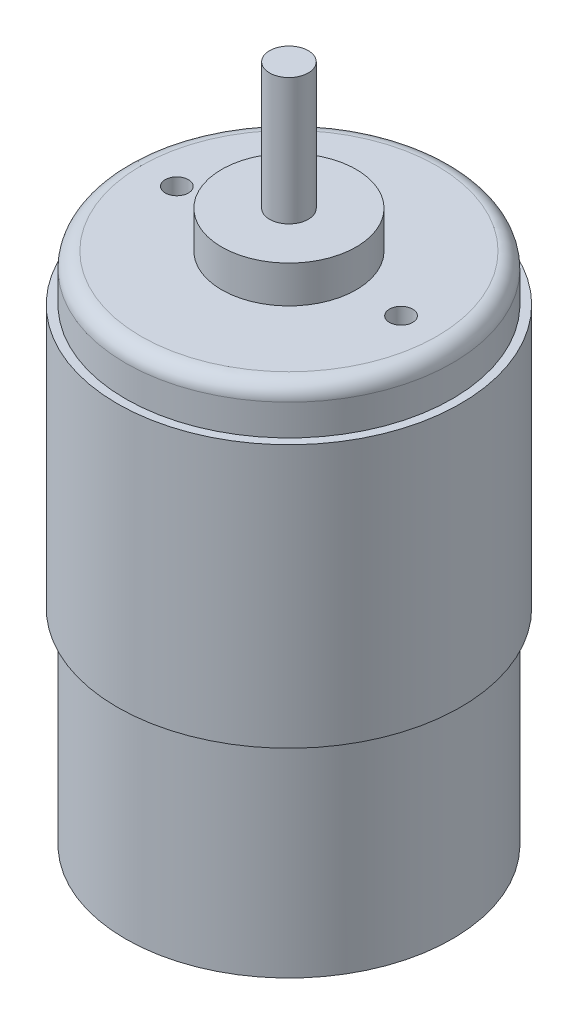
ISO-10303-21;
HEADER;
FILE_DESCRIPTION(('STEP AP214'),'2;1');
FILE_NAME('part.step','',(''),(''),'','','');
FILE_SCHEMA(('AUTOMOTIVE_DESIGN { 1 0 10303 214 1 1 1 1 }'));
ENDSEC;
DATA;
#1=APPLICATION_CONTEXT('core data for automotive mechanical design processes');
#2=APPLICATION_PROTOCOL_DEFINITION('international standard','automotive_design',2000,#1);
#3=PRODUCT_CONTEXT('',#1,'mechanical');
#4=PRODUCT('Part','Part','',(#3));
#5=PRODUCT_RELATED_PRODUCT_CATEGORY('part','',(#4));
#6=PRODUCT_DEFINITION_FORMATION('','',#4);
#7=PRODUCT_DEFINITION_CONTEXT('part definition',#1,'design');
#8=PRODUCT_DEFINITION('design','',#6,#7);
#9=PRODUCT_DEFINITION_SHAPE('','',#8);
#10=(LENGTH_UNIT() NAMED_UNIT(*) SI_UNIT(.MILLI.,.METRE.));
#11=(NAMED_UNIT(*) PLANE_ANGLE_UNIT() SI_UNIT($,.RADIAN.));
#12=(NAMED_UNIT(*) SI_UNIT($,.STERADIAN.) SOLID_ANGLE_UNIT());
#13=UNCERTAINTY_MEASURE_WITH_UNIT(LENGTH_MEASURE(1.E-05),#10,'distance_accuracy_value','');
#14=(GEOMETRIC_REPRESENTATION_CONTEXT(3) GLOBAL_UNCERTAINTY_ASSIGNED_CONTEXT((#13)) GLOBAL_UNIT_ASSIGNED_CONTEXT((#10,
#11,#12)) REPRESENTATION_CONTEXT('',''));
#15=CARTESIAN_POINT('',(0.,0.,0.));
#16=DIRECTION('',(0.,0.,1.));
#17=DIRECTION('',(1.,0.,0.));
#18=AXIS2_PLACEMENT_3D('',#15,#16,#17);
#19=CARTESIAN_POINT('',(0.,26.5,0.));
#20=DIRECTION('',(0.,1.,0.));
#21=DIRECTION('',(0.,0.,1.));
#22=AXIS2_PLACEMENT_3D('',#19,#20,#21);
#23=CYLINDRICAL_SURFACE('',#22,22.2);
#24=DIRECTION('',(0.,1.,0.));
#25=VECTOR('',#24,1.);
#26=CARTESIAN_POINT('',(1.25,26.5,-22.1647806215176));
#27=LINE('',#26,#25);
#28=CARTESIAN_POINT('',(1.25,26.5,-22.1647806215176));
#29=VERTEX_POINT('',#28);
#30=CARTESIAN_POINT('',(1.25,60.5,-22.1647806215176));
#31=VERTEX_POINT('',#30);
#32=EDGE_CURVE('E109',#29,#31,#27,.T.);
#33=ORIENTED_EDGE('',*,*,#32,.T.);
#34=CARTESIAN_POINT('',(0.,60.5,0.));
#35=DIRECTION('',(0.,1.,0.));
#36=DIRECTION('',(0.,0.,1.));
#37=AXIS2_PLACEMENT_3D('',#34,#35,#36);
#38=CIRCLE('',#37,22.2);
#39=CARTESIAN_POINT('',(-1.25,60.5,-22.1647806215176));
#40=VERTEX_POINT('',#39);
#41=EDGE_CURVE('E59',#40,#31,#38,.T.);
#42=ORIENTED_EDGE('',*,*,#41,.F.);
#43=DIRECTION('',(0.,1.,0.));
#44=VECTOR('',#43,1.);
#45=CARTESIAN_POINT('',(-1.25,26.5,-22.1647806215176));
#46=LINE('',#45,#44);
#47=CARTESIAN_POINT('',(-1.25,26.5,-22.1647806215176));
#48=VERTEX_POINT('',#47);
#49=EDGE_CURVE('E66',#48,#40,#46,.T.);
#50=ORIENTED_EDGE('',*,*,#49,.F.);
#51=CARTESIAN_POINT('',(0.,26.5,0.));
#52=DIRECTION('',(0.,1.,0.));
#53=DIRECTION('',(0.,0.,1.));
#54=AXIS2_PLACEMENT_3D('',#51,#52,#53);
#55=CIRCLE('',#54,22.2);
#56=EDGE_CURVE('E424',#48,#29,#55,.T.);
#57=ORIENTED_EDGE('',*,*,#56,.T.);
#58=EDGE_LOOP('',(#33,#42,#50,#57));
#59=FACE_BOUND('',#58,.T.);
#60=ADVANCED_FACE('F43',(#59),#23,.T.);
#61=CARTESIAN_POINT('',(-1.25,26.5,-21.0879853234016));
#62=DIRECTION('',(1.,0.,0.));
#63=DIRECTION('',(0.,0.,-1.));
#64=AXIS2_PLACEMENT_3D('',#61,#62,#63);
#65=PLANE('',#64);
#66=ORIENTED_EDGE('',*,*,#49,.T.);
#67=DIRECTION('',(0.,0.,-1.));
#68=VECTOR('',#67,1.);
#69=CARTESIAN_POINT('',(-1.25,60.5,-21.0879853234016));
#70=LINE('',#69,#68);
#71=CARTESIAN_POINT('',(-1.24999999999999,60.5,-21.0879853234016));
#72=VERTEX_POINT('',#71);
#73=EDGE_CURVE('E96',#72,#40,#70,.T.);
#74=ORIENTED_EDGE('',*,*,#73,.F.);
#75=DIRECTION('',(0.,1.,0.));
#76=VECTOR('',#75,1.);
#77=CARTESIAN_POINT('',(-1.24999999999999,26.5,-21.0879853234016));
#78=LINE('',#77,#76);
#79=CARTESIAN_POINT('',(-1.24999999999999,26.5,-21.0879853234016));
#80=VERTEX_POINT('',#79);
#81=EDGE_CURVE('E93',#80,#72,#78,.T.);
#82=ORIENTED_EDGE('',*,*,#81,.F.);
#83=DIRECTION('',(0.,0.,-1.));
#84=VECTOR('',#83,1.);
#85=CARTESIAN_POINT('',(-1.25,26.5,-21.0879853234016));
#86=LINE('',#85,#84);
#87=EDGE_CURVE('E114',#80,#48,#86,.T.);
#88=ORIENTED_EDGE('',*,*,#87,.T.);
#89=EDGE_LOOP('',(#66,#74,#82,#88));
#90=FACE_BOUND('',#89,.T.);
#91=ADVANCED_FACE('F185',(#90),#65,.T.);
#92=CARTESIAN_POINT('',(1.25,26.5,-21.0879853234016));
#93=DIRECTION('',(-1.,0.,0.));
#94=DIRECTION('',(0.,0.,1.));
#95=AXIS2_PLACEMENT_3D('',#92,#93,#94);
#96=PLANE('',#95);
#97=DIRECTION('',(0.,1.,0.));
#98=VECTOR('',#97,1.);
#99=CARTESIAN_POINT('',(1.25,26.5,-21.0879853234016));
#100=LINE('',#99,#98);
#101=CARTESIAN_POINT('',(1.25,26.5,-21.0879853234016));
#102=VERTEX_POINT('',#101);
#103=CARTESIAN_POINT('',(1.25,60.5,-21.0879853234016));
#104=VERTEX_POINT('',#103);
#105=EDGE_CURVE('E92',#102,#104,#100,.T.);
#106=ORIENTED_EDGE('',*,*,#105,.T.);
#107=DIRECTION('',(0.,0.,1.));
#108=VECTOR('',#107,1.);
#109=CARTESIAN_POINT('',(1.25,60.5,-21.0879853234016));
#110=LINE('',#109,#108);
#111=EDGE_CURVE('E97',#31,#104,#110,.T.);
#112=ORIENTED_EDGE('',*,*,#111,.F.);
#113=ORIENTED_EDGE('',*,*,#32,.F.);
#114=DIRECTION('',(0.,0.,1.));
#115=VECTOR('',#114,1.);
#116=CARTESIAN_POINT('',(1.25,26.5,-21.0879853234016));
#117=LINE('',#116,#115);
#118=EDGE_CURVE('E107',#29,#102,#117,.T.);
#119=ORIENTED_EDGE('',*,*,#118,.T.);
#120=EDGE_LOOP('',(#106,#112,#113,#119));
#121=FACE_BOUND('',#120,.T.);
#122=ADVANCED_FACE('F105',(#121),#96,.T.);
#123=CARTESIAN_POINT('',(0.,66.5,0.));
#124=DIRECTION('',(0.,1.,0.));
#125=DIRECTION('',(0.,0.,1.));
#126=AXIS2_PLACEMENT_3D('',#123,#124,#125);
#127=PLANE('',#126);
#128=CARTESIAN_POINT('',(0.,66.5,0.));
#129=DIRECTION('',(0.,1.,0.));
#130=DIRECTION('',(0.,0.,1.));
#131=AXIS2_PLACEMENT_3D('',#128,#129,#130);
#132=CIRCLE('',#131,19.125);
#133=CARTESIAN_POINT('',(0.,66.5,19.125));
#134=VERTEX_POINT('',#133);
#135=EDGE_CURVE('E52',#134,#134,#132,.T.);
#136=ORIENTED_EDGE('',*,*,#135,.T.);
#137=EDGE_LOOP('',(#136));
#138=FACE_BOUND('',#137,.T.);
#139=CARTESIAN_POINT('',(-14.5,66.5,0.));
#140=DIRECTION('',(0.,1.,0.));
#141=DIRECTION('',(0.,0.,1.));
#142=AXIS2_PLACEMENT_3D('',#139,#140,#141);
#143=CIRCLE('',#142,1.5);
#144=CARTESIAN_POINT('',(-14.5,66.5,1.5));
#145=VERTEX_POINT('',#144);
#146=EDGE_CURVE('E131',#145,#145,#143,.F.);
#147=ORIENTED_EDGE('',*,*,#146,.T.);
#148=EDGE_LOOP('',(#147));
#149=FACE_BOUND('',#148,.T.);
#150=CARTESIAN_POINT('',(0.,66.5,0.));
#151=DIRECTION('',(0.,1.,0.));
#152=DIRECTION('',(0.,0.,1.));
#153=AXIS2_PLACEMENT_3D('',#150,#151,#152);
#154=CIRCLE('',#153,8.7);
#155=CARTESIAN_POINT('',(0.,66.5,8.7));
#156=VERTEX_POINT('',#155);
#157=EDGE_CURVE('E143',#156,#156,#154,.T.);
#158=ORIENTED_EDGE('',*,*,#157,.F.);
#159=EDGE_LOOP('',(#158));
#160=FACE_BOUND('',#159,.T.);
#161=CARTESIAN_POINT('',(14.5,66.5,0.));
#162=DIRECTION('',(0.,1.,0.));
#163=DIRECTION('',(0.,0.,1.));
#164=AXIS2_PLACEMENT_3D('',#161,#162,#163);
#165=CIRCLE('',#164,1.5);
#166=CARTESIAN_POINT('',(14.5,66.5,1.5));
#167=VERTEX_POINT('',#166);
#168=EDGE_CURVE('E123',#167,#167,#165,.T.);
#169=ORIENTED_EDGE('',*,*,#168,.F.);
#170=EDGE_LOOP('',(#169));
#171=FACE_BOUND('',#170,.T.);
#172=ADVANCED_FACE('F173',(#138,#149,#160,#171),#127,.T.);
#173=CARTESIAN_POINT('',(0.,66.5,0.));
#174=DIRECTION('',(0.,-1.,0.));
#175=DIRECTION('',(0.,0.,-1.));
#176=AXIS2_PLACEMENT_3D('',#173,#174,#175);
#177=CYLINDRICAL_SURFACE('',#176,21.125);
#178=CARTESIAN_POINT('',(0.,64.5,0.));
#179=DIRECTION('',(0.,1.,0.));
#180=DIRECTION('',(0.,0.,1.));
#181=AXIS2_PLACEMENT_3D('',#178,#179,#180);
#182=CIRCLE('',#181,21.125);
#183=CARTESIAN_POINT('',(0.,64.5,21.125));
#184=VERTEX_POINT('',#183);
#185=EDGE_CURVE('E11',#184,#184,#182,.F.);
#186=ORIENTED_EDGE('',*,*,#185,.T.);
#187=EDGE_LOOP('',(#186));
#188=FACE_BOUND('',#187,.T.);
#189=CARTESIAN_POINT('',(0.,26.5,0.));
#190=DIRECTION('',(0.,-1.,0.));
#191=DIRECTION('',(0.,0.,1.));
#192=AXIS2_PLACEMENT_3D('',#189,#190,#191);
#193=CIRCLE('',#192,21.125);
#194=EDGE_CURVE('E429',#102,#80,#193,.T.);
#195=ORIENTED_EDGE('',*,*,#194,.T.);
#196=ORIENTED_EDGE('',*,*,#81,.T.);
#197=CARTESIAN_POINT('',(0.,60.5,0.));
#198=DIRECTION('',(0.,-1.,0.));
#199=DIRECTION('',(0.,0.,1.));
#200=AXIS2_PLACEMENT_3D('',#197,#198,#199);
#201=CIRCLE('',#200,21.125);
#202=EDGE_CURVE('E87',#104,#72,#201,.T.);
#203=ORIENTED_EDGE('',*,*,#202,.F.);
#204=ORIENTED_EDGE('',*,*,#105,.F.);
#205=EDGE_LOOP('',(#195,#196,#203,#204));
#206=FACE_BOUND('',#205,.T.);
#207=CARTESIAN_POINT('',(0.,0.,0.));
#208=DIRECTION('',(0.,1.,0.));
#209=DIRECTION('',(0.,0.,1.));
#210=AXIS2_PLACEMENT_3D('',#207,#208,#209);
#211=CIRCLE('',#210,21.125);
#212=CARTESIAN_POINT('',(0.,0.,21.125));
#213=VERTEX_POINT('',#212);
#214=EDGE_CURVE('E163',#213,#213,#211,.T.);
#215=ORIENTED_EDGE('',*,*,#214,.T.);
#216=EDGE_LOOP('',(#215));
#217=FACE_BOUND('',#216,.T.);
#218=ADVANCED_FACE('F89',(#188,#206,#217),#177,.T.);
#219=CARTESIAN_POINT('',(0.,0.,0.));
#220=DIRECTION('',(0.,1.,0.));
#221=DIRECTION('',(0.,0.,1.));
#222=AXIS2_PLACEMENT_3D('',#219,#220,#221);
#223=PLANE('',#222);
#224=CARTESIAN_POINT('',(0.,0.,0.));
#225=DIRECTION('',(0.,-1.,0.));
#226=DIRECTION('',(0.,0.,-1.));
#227=AXIS2_PLACEMENT_3D('',#224,#225,#226);
#228=CIRCLE('',#227,7.2);
#229=CARTESIAN_POINT('',(0.,0.,-7.2));
#230=VERTEX_POINT('',#229);
#231=EDGE_CURVE('E159',#230,#230,#228,.T.);
#232=ORIENTED_EDGE('',*,*,#231,.F.);
#233=EDGE_LOOP('',(#232));
#234=FACE_BOUND('',#233,.T.);
#235=ORIENTED_EDGE('',*,*,#214,.F.);
#236=EDGE_LOOP('',(#235));
#237=FACE_BOUND('',#236,.T.);
#238=ADVANCED_FACE('F241',(#234,#237),#223,.F.);
#239=CARTESIAN_POINT('',(0.,-4.,0.));
#240=DIRECTION('',(0.,1.,0.));
#241=DIRECTION('',(0.,0.,1.));
#242=AXIS2_PLACEMENT_3D('',#239,#240,#241);
#243=CYLINDRICAL_SURFACE('',#242,7.2);
#244=CARTESIAN_POINT('',(0.,-4.,0.));
#245=DIRECTION('',(0.,-1.,0.));
#246=DIRECTION('',(0.,0.,-1.));
#247=AXIS2_PLACEMENT_3D('',#244,#245,#246);
#248=CIRCLE('',#247,7.2);
#249=CARTESIAN_POINT('',(0.,-4.,-7.2));
#250=VERTEX_POINT('',#249);
#251=EDGE_CURVE('E155',#250,#250,#248,.T.);
#252=ORIENTED_EDGE('',*,*,#251,.F.);
#253=EDGE_LOOP('',(#252));
#254=FACE_BOUND('',#253,.T.);
#255=ORIENTED_EDGE('',*,*,#231,.T.);
#256=EDGE_LOOP('',(#255));
#257=FACE_BOUND('',#256,.T.);
#258=ADVANCED_FACE('F237',(#254,#257),#243,.T.);
#259=CARTESIAN_POINT('',(0.,-4.,0.));
#260=DIRECTION('',(0.,-1.,0.));
#261=DIRECTION('',(0.,0.,-1.));
#262=AXIS2_PLACEMENT_3D('',#259,#260,#261);
#263=PLANE('',#262);
#264=CARTESIAN_POINT('',(0.,-4.,0.));
#265=DIRECTION('',(0.,-1.,0.));
#266=DIRECTION('',(0.,0.,-1.));
#267=AXIS2_PLACEMENT_3D('',#264,#265,#266);
#268=CIRCLE('',#267,2.5);
#269=CARTESIAN_POINT('',(0.,-4.,2.5));
#270=VERTEX_POINT('',#269);
#271=EDGE_CURVE('E151',#270,#270,#268,.T.);
#272=ORIENTED_EDGE('',*,*,#271,.F.);
#273=EDGE_LOOP('',(#272));
#274=FACE_BOUND('',#273,.T.);
#275=ORIENTED_EDGE('',*,*,#251,.T.);
#276=EDGE_LOOP('',(#275));
#277=FACE_BOUND('',#276,.T.);
#278=ADVANCED_FACE('F233',(#274,#277),#263,.T.);
#279=CARTESIAN_POINT('',(0.,-10.2,0.));
#280=DIRECTION('',(0.,1.,0.));
#281=DIRECTION('',(0.,0.,1.));
#282=AXIS2_PLACEMENT_3D('',#279,#280,#281);
#283=CYLINDRICAL_SURFACE('',#282,2.5);
#284=CARTESIAN_POINT('',(0.,-10.2,0.));
#285=DIRECTION('',(0.,-1.,0.));
#286=DIRECTION('',(0.,0.,-1.));
#287=AXIS2_PLACEMENT_3D('',#284,#285,#286);
#288=CIRCLE('',#287,2.5);
#289=CARTESIAN_POINT('',(0.,-10.2,2.5));
#290=VERTEX_POINT('',#289);
#291=EDGE_CURVE('E147',#290,#290,#288,.T.);
#292=CARTESIAN_POINT('',(0.,-10.2,2.5));
#293=CARTESIAN_POINT('',(0.,-10.1354166666667,2.5));
#294=CARTESIAN_POINT('',(0.,-10.0708333333333,2.5));
#295=CARTESIAN_POINT('',(0.,-9.94166666666667,2.5));
#296=CARTESIAN_POINT('',(0.,-9.87708333333333,2.5));
#297=CARTESIAN_POINT('',(0.,-9.74791666666667,2.5));
#298=CARTESIAN_POINT('',(0.,-9.68333333333333,2.5));
#299=CARTESIAN_POINT('',(0.,-9.55416666666667,2.5));
#300=CARTESIAN_POINT('',(0.,-9.48958333333333,2.5));
#301=CARTESIAN_POINT('',(0.,-9.36041666666667,2.5));
#302=CARTESIAN_POINT('',(0.,-9.29583333333333,2.5));
#303=CARTESIAN_POINT('',(0.,-9.16666666666667,2.5));
#304=CARTESIAN_POINT('',(0.,-9.10208333333333,2.5));
#305=CARTESIAN_POINT('',(0.,-8.97291666666667,2.5));
#306=CARTESIAN_POINT('',(0.,-8.90833333333333,2.5));
#307=CARTESIAN_POINT('',(0.,-8.77916666666667,2.5));
#308=CARTESIAN_POINT('',(0.,-8.71458333333333,2.5));
#309=CARTESIAN_POINT('',(0.,-8.58541666666667,2.5));
#310=CARTESIAN_POINT('',(0.,-8.52083333333333,2.5));
#311=CARTESIAN_POINT('',(0.,-8.39166666666667,2.5));
#312=CARTESIAN_POINT('',(0.,-8.32708333333333,2.5));
#313=CARTESIAN_POINT('',(0.,-8.19791666666667,2.5));
#314=CARTESIAN_POINT('',(0.,-8.13333333333333,2.5));
#315=CARTESIAN_POINT('',(0.,-8.00416666666667,2.5));
#316=CARTESIAN_POINT('',(0.,-7.93958333333333,2.5));
#317=CARTESIAN_POINT('',(0.,-7.81041666666667,2.5));
#318=CARTESIAN_POINT('',(0.,-7.74583333333333,2.5));
#319=CARTESIAN_POINT('',(0.,-7.61666666666667,2.5));
#320=CARTESIAN_POINT('',(0.,-7.55208333333333,2.5));
#321=CARTESIAN_POINT('',(0.,-7.42291666666667,2.5));
#322=CARTESIAN_POINT('',(0.,-7.35833333333333,2.5));
#323=CARTESIAN_POINT('',(0.,-7.22916666666667,2.5));
#324=CARTESIAN_POINT('',(0.,-7.16458333333333,2.5));
#325=CARTESIAN_POINT('',(0.,-7.03541666666667,2.5));
#326=CARTESIAN_POINT('',(0.,-6.97083333333333,2.5));
#327=CARTESIAN_POINT('',(0.,-6.84166666666667,2.5));
#328=CARTESIAN_POINT('',(0.,-6.77708333333333,2.5));
#329=CARTESIAN_POINT('',(0.,-6.64791666666667,2.5));
#330=CARTESIAN_POINT('',(0.,-6.58333333333333,2.5));
#331=CARTESIAN_POINT('',(0.,-6.45416666666667,2.5));
#332=CARTESIAN_POINT('',(0.,-6.38958333333333,2.5));
#333=CARTESIAN_POINT('',(0.,-6.26041666666667,2.5));
#334=CARTESIAN_POINT('',(0.,-6.19583333333333,2.5));
#335=CARTESIAN_POINT('',(0.,-6.06666666666667,2.5));
#336=CARTESIAN_POINT('',(0.,-6.00208333333333,2.5));
#337=CARTESIAN_POINT('',(0.,-5.87291666666667,2.5));
#338=CARTESIAN_POINT('',(0.,-5.80833333333333,2.5));
#339=CARTESIAN_POINT('',(0.,-5.67916666666667,2.5));
#340=CARTESIAN_POINT('',(0.,-5.61458333333333,2.5));
#341=CARTESIAN_POINT('',(0.,-5.48541666666667,2.5));
#342=CARTESIAN_POINT('',(0.,-5.42083333333333,2.5));
#343=CARTESIAN_POINT('',(0.,-5.29166666666667,2.5));
#344=CARTESIAN_POINT('',(0.,-5.22708333333333,2.5));
#345=CARTESIAN_POINT('',(0.,-5.09791666666667,2.5));
#346=CARTESIAN_POINT('',(0.,-5.03333333333333,2.5));
#347=CARTESIAN_POINT('',(0.,-4.90416666666667,2.5));
#348=CARTESIAN_POINT('',(0.,-4.83958333333333,2.5));
#349=CARTESIAN_POINT('',(0.,-4.71041666666667,2.5));
#350=CARTESIAN_POINT('',(0.,-4.64583333333333,2.5));
#351=CARTESIAN_POINT('',(0.,-4.51666666666667,2.5));
#352=CARTESIAN_POINT('',(0.,-4.45208333333333,2.5));
#353=CARTESIAN_POINT('',(0.,-4.32291666666667,2.5));
#354=CARTESIAN_POINT('',(0.,-4.25833333333333,2.5));
#355=CARTESIAN_POINT('',(0.,-4.12916666666667,2.5));
#356=CARTESIAN_POINT('',(0.,-4.06458333333333,2.5));
#357=CARTESIAN_POINT('',(0.,-4.,2.5));
#358=B_SPLINE_CURVE_WITH_KNOTS('',3,(#292,#293,#294,#295,#296,#297,#298,#299,#300,#301,#302,
#303,#304,#305,#306,#307,#308,#309,#310,#311,#312,#313,#314,#315,#316,#317,#318,#319,#320,#321,
#322,#323,#324,#325,#326,#327,#328,#329,#330,#331,#332,#333,#334,#335,#336,#337,#338,#339,#340,
#341,#342,#343,#344,#345,#346,#347,#348,#349,#350,#351,#352,#353,#354,#355,#356,#357),
.UNSPECIFIED.,.F.,.F.,(4,2,2,2,2,2,2,2,2,2,2,2,2,2,2,2,2,2,2,2,2,2,2,2,2,2,2,2,2,2,2,2,4),(0.,
0.193750000000001,0.387500000000001,0.58125,0.775000000000001,0.968750000000001,1.1625,1.35625,
1.55,1.74375,1.9375,2.13125,2.325,2.51875,2.7125,2.90625,3.1,3.29375,3.4875,3.68125,3.875,
4.06875,4.2625,4.45625,4.65,4.84375,5.0375,5.23125,5.425,5.61875,5.8125,6.00625,6.2),.UNSPECIFIED.);
#359=EDGE_CURVE('BSEAM229',#290,#270,#358,.T.);
#360=ORIENTED_EDGE('',*,*,#291,.F.);
#361=ORIENTED_EDGE('',*,*,#271,.T.);
#362=ORIENTED_EDGE('',*,*,#359,.T.);
#363=ORIENTED_EDGE('',*,*,#359,.F.);
#364=EDGE_LOOP('',(#360,#362,#361,#363));
#365=FACE_BOUND('',#364,.T.);
#366=ADVANCED_FACE('F229',(#365),#283,.T.);
#367=CARTESIAN_POINT('',(0.,-10.2,0.));
#368=DIRECTION('',(0.,-1.,0.));
#369=DIRECTION('',(0.,0.,-1.));
#370=AXIS2_PLACEMENT_3D('',#367,#368,#369);
#371=PLANE('',#370);
#372=ORIENTED_EDGE('',*,*,#291,.T.);
#373=EDGE_LOOP('',(#372));
#374=FACE_BOUND('',#373,.T.);
#375=ADVANCED_FACE('F225',(#374),#371,.T.);
#376=CARTESIAN_POINT('',(0.,71.3,0.));
#377=DIRECTION('',(0.,-1.,0.));
#378=DIRECTION('',(0.,0.,-1.));
#379=AXIS2_PLACEMENT_3D('',#376,#377,#378);
#380=CYLINDRICAL_SURFACE('',#379,8.7);
#381=CARTESIAN_POINT('',(0.,71.3,0.));
#382=DIRECTION('',(0.,1.,0.));
#383=DIRECTION('',(0.,0.,1.));
#384=AXIS2_PLACEMENT_3D('',#381,#382,#383);
#385=CIRCLE('',#384,8.7);
#386=CARTESIAN_POINT('',(0.,71.3,8.7));
#387=VERTEX_POINT('',#386);
#388=EDGE_CURVE('E138',#387,#387,#385,.T.);
#389=ORIENTED_EDGE('',*,*,#388,.F.);
#390=EDGE_LOOP('',(#389));
#391=FACE_BOUND('',#390,.T.);
#392=ORIENTED_EDGE('',*,*,#157,.T.);
#393=EDGE_LOOP('',(#392));
#394=FACE_BOUND('',#393,.T.);
#395=ADVANCED_FACE('F221',(#391,#394),#380,.T.);
#396=CARTESIAN_POINT('',(0.,71.3,0.));
#397=DIRECTION('',(0.,1.,0.));
#398=DIRECTION('',(0.,0.,1.));
#399=AXIS2_PLACEMENT_3D('',#396,#397,#398);
#400=PLANE('',#399);
#401=CARTESIAN_POINT('',(0.,71.3,0.));
#402=DIRECTION('',(0.,1.,0.));
#403=DIRECTION('',(0.,0.,1.));
#404=AXIS2_PLACEMENT_3D('',#401,#402,#403);
#405=CIRCLE('',#404,2.5);
#406=CARTESIAN_POINT('',(0.,71.3,2.5));
#407=VERTEX_POINT('',#406);
#408=EDGE_CURVE('E139',#407,#407,#405,.T.);
#409=ORIENTED_EDGE('',*,*,#408,.F.);
#410=EDGE_LOOP('',(#409));
#411=FACE_BOUND('',#410,.T.);
#412=ORIENTED_EDGE('',*,*,#388,.T.);
#413=EDGE_LOOP('',(#412));
#414=FACE_BOUND('',#413,.T.);
#415=ADVANCED_FACE('F217',(#411,#414),#400,.T.);
#416=CARTESIAN_POINT('',(0.,87.7,0.));
#417=DIRECTION('',(0.,-1.,0.));
#418=DIRECTION('',(0.,0.,-1.));
#419=AXIS2_PLACEMENT_3D('',#416,#417,#418);
#420=CYLINDRICAL_SURFACE('',#419,2.5);
#421=CARTESIAN_POINT('',(0.,87.7,0.));
#422=DIRECTION('',(0.,1.,0.));
#423=DIRECTION('',(0.,0.,1.));
#424=AXIS2_PLACEMENT_3D('',#421,#422,#423);
#425=CIRCLE('',#424,2.5);
#426=CARTESIAN_POINT('',(0.,87.7,2.5));
#427=VERTEX_POINT('',#426);
#428=EDGE_CURVE('E122',#427,#427,#425,.T.);
#429=ORIENTED_EDGE('',*,*,#428,.F.);
#430=EDGE_LOOP('',(#429));
#431=FACE_BOUND('',#430,.T.);
#432=ORIENTED_EDGE('',*,*,#408,.T.);
#433=EDGE_LOOP('',(#432));
#434=FACE_BOUND('',#433,.T.);
#435=ADVANCED_FACE('F213',(#431,#434),#420,.T.);
#436=CARTESIAN_POINT('',(0.,87.7,0.));
#437=DIRECTION('',(0.,1.,0.));
#438=DIRECTION('',(0.,0.,1.));
#439=AXIS2_PLACEMENT_3D('',#436,#437,#438);
#440=PLANE('',#439);
#441=ORIENTED_EDGE('',*,*,#428,.T.);
#442=EDGE_LOOP('',(#441));
#443=FACE_BOUND('',#442,.T.);
#444=ADVANCED_FACE('F209',(#443),#440,.T.);
#445=CARTESIAN_POINT('',(-14.5,61.5,0.));
#446=DIRECTION('',(0.,1.,0.));
#447=DIRECTION('',(0.,0.,1.));
#448=AXIS2_PLACEMENT_3D('',#445,#446,#447);
#449=CYLINDRICAL_SURFACE('',#448,1.5);
#450=CARTESIAN_POINT('',(-14.5,61.5,0.));
#451=DIRECTION('',(0.,1.,0.));
#452=DIRECTION('',(0.,0.,1.));
#453=AXIS2_PLACEMENT_3D('',#450,#451,#452);
#454=CIRCLE('',#453,1.5);
#455=CARTESIAN_POINT('',(-14.5,61.5,1.5));
#456=VERTEX_POINT('',#455);
#457=EDGE_CURVE('E127',#456,#456,#454,.F.);
#458=ORIENTED_EDGE('',*,*,#457,.T.);
#459=EDGE_LOOP('',(#458));
#460=FACE_BOUND('',#459,.T.);
#461=ORIENTED_EDGE('',*,*,#146,.F.);
#462=EDGE_LOOP('',(#461));
#463=FACE_BOUND('',#462,.T.);
#464=ADVANCED_FACE('F205',(#460,#463),#449,.F.);
#465=CARTESIAN_POINT('',(0.,61.5,0.));
#466=DIRECTION('',(0.,1.,0.));
#467=DIRECTION('',(0.,0.,1.));
#468=AXIS2_PLACEMENT_3D('',#465,#466,#467);
#469=PLANE('',#468);
#470=ORIENTED_EDGE('',*,*,#457,.F.);
#471=EDGE_LOOP('',(#470));
#472=FACE_BOUND('',#471,.T.);
#473=ADVANCED_FACE('F201',(#472),#469,.T.);
#474=CARTESIAN_POINT('',(14.5,61.5,0.));
#475=DIRECTION('',(0.,1.,0.));
#476=DIRECTION('',(0.,0.,1.));
#477=AXIS2_PLACEMENT_3D('',#474,#475,#476);
#478=CYLINDRICAL_SURFACE('',#477,1.5);
#479=CARTESIAN_POINT('',(14.5,61.5,0.));
#480=DIRECTION('',(0.,1.,0.));
#481=DIRECTION('',(0.,0.,1.));
#482=AXIS2_PLACEMENT_3D('',#479,#480,#481);
#483=CIRCLE('',#482,1.5);
#484=CARTESIAN_POINT('',(14.5,61.5,1.5));
#485=VERTEX_POINT('',#484);
#486=EDGE_CURVE('E118',#485,#485,#483,.T.);
#487=ORIENTED_EDGE('',*,*,#486,.F.);
#488=EDGE_LOOP('',(#487));
#489=FACE_BOUND('',#488,.T.);
#490=ORIENTED_EDGE('',*,*,#168,.T.);
#491=EDGE_LOOP('',(#490));
#492=FACE_BOUND('',#491,.T.);
#493=ADVANCED_FACE('F197',(#489,#492),#478,.F.);
#494=CARTESIAN_POINT('',(0.,61.5,0.));
#495=DIRECTION('',(0.,1.,0.));
#496=DIRECTION('',(0.,0.,1.));
#497=AXIS2_PLACEMENT_3D('',#494,#495,#496);
#498=PLANE('',#497);
#499=ORIENTED_EDGE('',*,*,#486,.T.);
#500=EDGE_LOOP('',(#499));
#501=FACE_BOUND('',#500,.T.);
#502=ADVANCED_FACE('F194',(#501),#498,.T.);
#503=CARTESIAN_POINT('',(0.,26.5,0.));
#504=DIRECTION('',(0.,1.,0.));
#505=DIRECTION('',(0.,0.,1.));
#506=AXIS2_PLACEMENT_3D('',#503,#504,#505);
#507=PLANE('',#506);
#508=ORIENTED_EDGE('',*,*,#56,.F.);
#509=ORIENTED_EDGE('',*,*,#87,.F.);
#510=ORIENTED_EDGE('',*,*,#194,.F.);
#511=ORIENTED_EDGE('',*,*,#118,.F.);
#512=EDGE_LOOP('',(#508,#509,#510,#511));
#513=FACE_BOUND('',#512,.T.);
#514=ADVANCED_FACE('F181',(#513),#507,.F.);
#515=CARTESIAN_POINT('',(0.,60.5,0.));
#516=DIRECTION('',(0.,1.,0.));
#517=DIRECTION('',(0.,0.,1.));
#518=AXIS2_PLACEMENT_3D('',#515,#516,#517);
#519=PLANE('',#518);
#520=ORIENTED_EDGE('',*,*,#41,.T.);
#521=ORIENTED_EDGE('',*,*,#111,.T.);
#522=ORIENTED_EDGE('',*,*,#202,.T.);
#523=ORIENTED_EDGE('',*,*,#73,.T.);
#524=EDGE_LOOP('',(#520,#521,#522,#523));
#525=FACE_BOUND('',#524,.T.);
#526=ADVANCED_FACE('F99',(#525),#519,.T.);
#527=CARTESIAN_POINT('',(0.,64.5,0.));
#528=DIRECTION('',(0.,1.,0.));
#529=DIRECTION('',(0.,0.,1.));
#530=AXIS2_PLACEMENT_3D('',#527,#528,#529);
#531=TOROIDAL_SURFACE('',#530,19.125,2.);
#532=ORIENTED_EDGE('',*,*,#185,.F.);
#533=EDGE_LOOP('',(#532));
#534=FACE_BOUND('',#533,.T.);
#535=ORIENTED_EDGE('',*,*,#135,.F.);
#536=EDGE_LOOP('',(#535));
#537=FACE_BOUND('',#536,.T.);
#538=ADVANCED_FACE('F45',(#534,#537),#531,.T.);
#539=CLOSED_SHELL('',(#60,#91,#122,#172,#218,#238,#258,#278,#366,#375,#395,#415,#435,#444,#464,
#473,#493,#502,#514,#526,#538));
#540=MANIFOLD_SOLID_BREP('B2',#539);
#541=ADVANCED_BREP_SHAPE_REPRESENTATION('',(#18,#540),#14);
#542=SHAPE_DEFINITION_REPRESENTATION(#9,#541);
ENDSEC;
END-ISO-10303-21;
